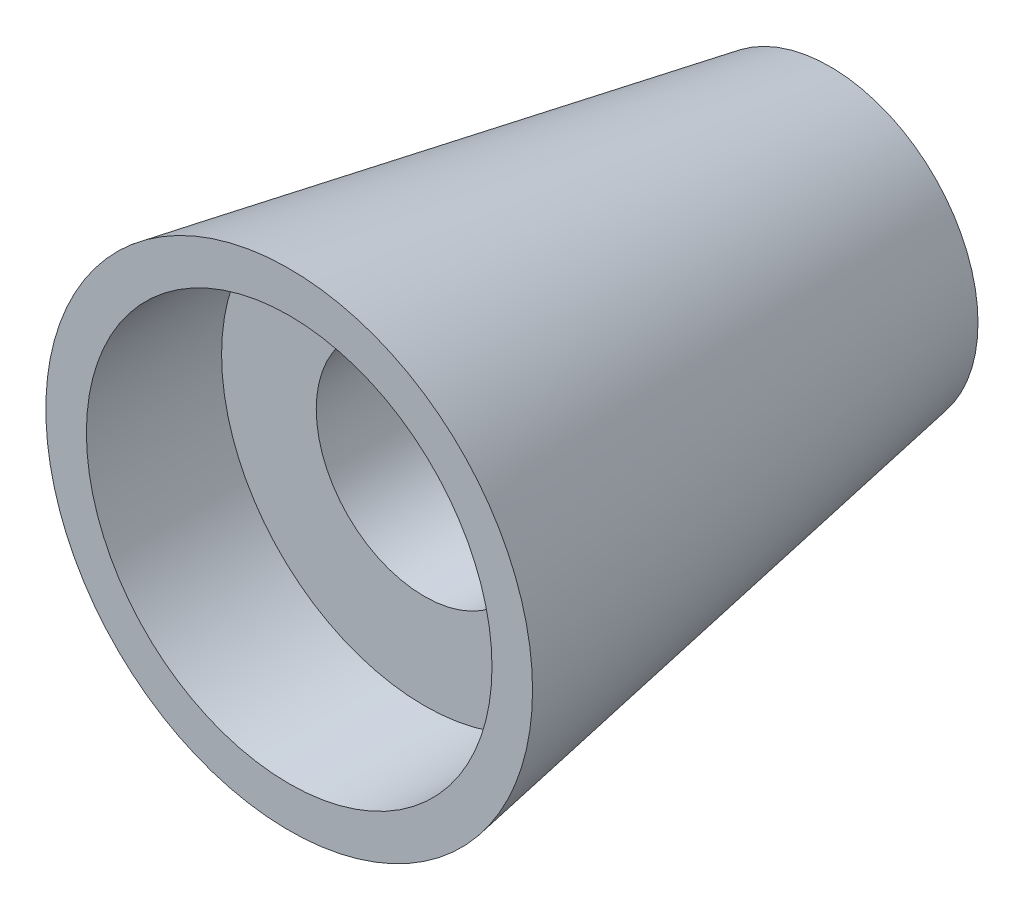
ISO-10303-21;
HEADER;
FILE_DESCRIPTION(('STEP AP214'),'2;1');
FILE_NAME('part.step','',(''),(''),'','','');
FILE_SCHEMA(('AUTOMOTIVE_DESIGN { 1 0 10303 214 1 1 1 1 }'));
ENDSEC;
DATA;
#1=APPLICATION_CONTEXT('core data for automotive mechanical design processes');
#2=APPLICATION_PROTOCOL_DEFINITION('international standard','automotive_design',2000,#1);
#3=PRODUCT_CONTEXT('',#1,'mechanical');
#4=PRODUCT('Part','Part','',(#3));
#5=PRODUCT_RELATED_PRODUCT_CATEGORY('part','',(#4));
#6=PRODUCT_DEFINITION_FORMATION('','',#4);
#7=PRODUCT_DEFINITION_CONTEXT('part definition',#1,'design');
#8=PRODUCT_DEFINITION('design','',#6,#7);
#9=PRODUCT_DEFINITION_SHAPE('','',#8);
#10=(LENGTH_UNIT() NAMED_UNIT(*) SI_UNIT(.MILLI.,.METRE.));
#11=(NAMED_UNIT(*) PLANE_ANGLE_UNIT() SI_UNIT($,.RADIAN.));
#12=(NAMED_UNIT(*) SI_UNIT($,.STERADIAN.) SOLID_ANGLE_UNIT());
#13=UNCERTAINTY_MEASURE_WITH_UNIT(LENGTH_MEASURE(1.E-05),#10,'distance_accuracy_value','');
#14=(GEOMETRIC_REPRESENTATION_CONTEXT(3) GLOBAL_UNCERTAINTY_ASSIGNED_CONTEXT((#13)) GLOBAL_UNIT_ASSIGNED_CONTEXT((#10,
#11,#12)) REPRESENTATION_CONTEXT('',''));
#15=CARTESIAN_POINT('',(0.,0.,0.));
#16=DIRECTION('',(0.,0.,1.));
#17=DIRECTION('',(1.,0.,0.));
#18=AXIS2_PLACEMENT_3D('',#15,#16,#17);
#19=CARTESIAN_POINT('',(0.,0.,20.));
#20=DIRECTION('',(0.,0.,1.));
#21=DIRECTION('',(1.,0.,0.));
#22=AXIS2_PLACEMENT_3D('',#19,#20,#21);
#23=CONICAL_SURFACE('',#22,9.,0.174532925199433);
#24=CARTESIAN_POINT('',(0.,0.,20.));
#25=DIRECTION('',(0.,0.,1.));
#26=DIRECTION('',(1.,0.,0.));
#27=AXIS2_PLACEMENT_3D('',#24,#25,#26);
#28=CIRCLE('',#27,9.);
#29=CARTESIAN_POINT('',(9.,0.,20.));
#30=VERTEX_POINT('',#29);
#31=EDGE_CURVE('E10',#30,#30,#28,.T.);
#32=ORIENTED_EDGE('',*,*,#31,.F.);
#33=EDGE_LOOP('',(#32));
#34=FACE_BOUND('',#33,.T.);
#35=CARTESIAN_POINT('',(0.,0.,0.));
#36=DIRECTION('',(0.,0.,1.));
#37=DIRECTION('',(1.,0.,0.));
#38=AXIS2_PLACEMENT_3D('',#35,#36,#37);
#39=CIRCLE('',#38,5.47346038583069);
#40=CARTESIAN_POINT('',(5.47346038583069,0.,0.));
#41=VERTEX_POINT('',#40);
#42=EDGE_CURVE('E34',#41,#41,#39,.T.);
#43=ORIENTED_EDGE('',*,*,#42,.T.);
#44=EDGE_LOOP('',(#43));
#45=FACE_BOUND('',#44,.T.);
#46=ADVANCED_FACE('F27',(#34,#45),#23,.T.);
#47=CARTESIAN_POINT('',(0.,0.,20.));
#48=DIRECTION('',(0.,0.,1.));
#49=DIRECTION('',(1.,0.,0.));
#50=AXIS2_PLACEMENT_3D('',#47,#48,#49);
#51=PLANE('',#50);
#52=CARTESIAN_POINT('',(0.,0.,20.));
#53=DIRECTION('',(0.,0.,1.));
#54=DIRECTION('',(1.,0.,0.));
#55=AXIS2_PLACEMENT_3D('',#52,#53,#54);
#56=CIRCLE('',#55,7.5);
#57=CARTESIAN_POINT('',(7.5,0.,20.));
#58=VERTEX_POINT('',#57);
#59=EDGE_CURVE('E46',#58,#58,#56,.T.);
#60=ORIENTED_EDGE('',*,*,#59,.F.);
#61=EDGE_LOOP('',(#60));
#62=FACE_BOUND('',#61,.T.);
#63=ORIENTED_EDGE('',*,*,#31,.T.);
#64=EDGE_LOOP('',(#63));
#65=FACE_BOUND('',#64,.T.);
#66=ADVANCED_FACE('F62',(#62,#65),#51,.T.);
#67=CARTESIAN_POINT('',(0.,0.,0.));
#68=DIRECTION('',(0.,0.,1.));
#69=DIRECTION('',(1.,0.,0.));
#70=AXIS2_PLACEMENT_3D('',#67,#68,#69);
#71=PLANE('',#70);
#72=CARTESIAN_POINT('',(0.,0.,0.));
#73=DIRECTION('',(0.,0.,-1.));
#74=DIRECTION('',(-1.,0.,0.));
#75=AXIS2_PLACEMENT_3D('',#72,#73,#74);
#76=CIRCLE('',#75,4.25);
#77=CARTESIAN_POINT('',(-4.25,0.,0.));
#78=VERTEX_POINT('',#77);
#79=EDGE_CURVE('E52',#78,#78,#76,.T.);
#80=ORIENTED_EDGE('',*,*,#79,.F.);
#81=EDGE_LOOP('',(#80));
#82=FACE_BOUND('',#81,.T.);
#83=ORIENTED_EDGE('',*,*,#42,.F.);
#84=EDGE_LOOP('',(#83));
#85=FACE_BOUND('',#84,.T.);
#86=ADVANCED_FACE('F58',(#82,#85),#71,.F.);
#87=CARTESIAN_POINT('',(0.,0.,15.));
#88=DIRECTION('',(0.,0.,1.));
#89=DIRECTION('',(1.,0.,0.));
#90=AXIS2_PLACEMENT_3D('',#87,#88,#89);
#91=PLANE('',#90);
#92=CARTESIAN_POINT('',(0.,0.,15.));
#93=DIRECTION('',(0.,0.,1.));
#94=DIRECTION('',(1.,0.,0.));
#95=AXIS2_PLACEMENT_3D('',#92,#93,#94);
#96=CIRCLE('',#95,7.5);
#97=CARTESIAN_POINT('',(7.5,0.,15.));
#98=VERTEX_POINT('',#97);
#99=EDGE_CURVE('E43',#98,#98,#96,.T.);
#100=ORIENTED_EDGE('',*,*,#99,.T.);
#101=EDGE_LOOP('',(#100));
#102=FACE_BOUND('',#101,.T.);
#103=CARTESIAN_POINT('',(0.,0.,15.));
#104=DIRECTION('',(0.,0.,1.));
#105=DIRECTION('',(1.,0.,0.));
#106=AXIS2_PLACEMENT_3D('',#103,#104,#105);
#107=CIRCLE('',#106,4.);
#108=CARTESIAN_POINT('',(4.,0.,15.));
#109=VERTEX_POINT('',#108);
#110=EDGE_CURVE('E30',#109,#109,#107,.F.);
#111=ORIENTED_EDGE('',*,*,#110,.T.);
#112=EDGE_LOOP('',(#111));
#113=FACE_BOUND('',#112,.T.);
#114=ADVANCED_FACE('F61',(#102,#113),#91,.T.);
#115=CARTESIAN_POINT('',(0.,0.,15.));
#116=DIRECTION('',(0.,0.,1.));
#117=DIRECTION('',(1.,0.,0.));
#118=AXIS2_PLACEMENT_3D('',#115,#116,#117);
#119=CYLINDRICAL_SURFACE('',#118,7.5);
#120=ORIENTED_EDGE('',*,*,#99,.F.);
#121=EDGE_LOOP('',(#120));
#122=FACE_BOUND('',#121,.T.);
#123=ORIENTED_EDGE('',*,*,#59,.T.);
#124=EDGE_LOOP('',(#123));
#125=FACE_BOUND('',#124,.T.);
#126=ADVANCED_FACE('F83',(#122,#125),#119,.F.);
#127=CARTESIAN_POINT('',(0.,0.,10.));
#128=DIRECTION('',(0.,0.,1.));
#129=DIRECTION('',(1.,0.,0.));
#130=AXIS2_PLACEMENT_3D('',#127,#128,#129);
#131=PLANE('',#130);
#132=CARTESIAN_POINT('',(0.,0.,10.));
#133=DIRECTION('',(0.,0.,1.));
#134=DIRECTION('',(1.,0.,0.));
#135=AXIS2_PLACEMENT_3D('',#132,#133,#134);
#136=CIRCLE('',#135,4.);
#137=CARTESIAN_POINT('',(4.,0.,10.));
#138=VERTEX_POINT('',#137);
#139=EDGE_CURVE('E39',#138,#138,#136,.T.);
#140=ORIENTED_EDGE('',*,*,#139,.T.);
#141=EDGE_LOOP('',(#140));
#142=FACE_BOUND('',#141,.T.);
#143=ADVANCED_FACE('F79',(#142),#131,.T.);
#144=CARTESIAN_POINT('',(0.,0.,10.));
#145=DIRECTION('',(0.,0.,1.));
#146=DIRECTION('',(1.,0.,0.));
#147=AXIS2_PLACEMENT_3D('',#144,#145,#146);
#148=CYLINDRICAL_SURFACE('',#147,4.);
#149=ORIENTED_EDGE('',*,*,#139,.F.);
#150=EDGE_LOOP('',(#149));
#151=FACE_BOUND('',#150,.T.);
#152=ORIENTED_EDGE('',*,*,#110,.F.);
#153=EDGE_LOOP('',(#152));
#154=FACE_BOUND('',#153,.T.);
#155=ADVANCED_FACE('F76',(#151,#154),#148,.F.);
#156=CARTESIAN_POINT('',(0.,0.,0.5));
#157=DIRECTION('',(0.,0.,-1.));
#158=DIRECTION('',(-1.,0.,0.));
#159=AXIS2_PLACEMENT_3D('',#156,#157,#158);
#160=CYLINDRICAL_SURFACE('',#159,4.25);
#161=CARTESIAN_POINT('',(0.,0.,0.5));
#162=DIRECTION('',(0.,0.,-1.));
#163=DIRECTION('',(-1.,0.,0.));
#164=AXIS2_PLACEMENT_3D('',#161,#162,#163);
#165=CIRCLE('',#164,4.25);
#166=CARTESIAN_POINT('',(-4.25,0.,0.5));
#167=VERTEX_POINT('',#166);
#168=EDGE_CURVE('E49',#167,#167,#165,.T.);
#169=ORIENTED_EDGE('',*,*,#168,.F.);
#170=EDGE_LOOP('',(#169));
#171=FACE_BOUND('',#170,.T.);
#172=ORIENTED_EDGE('',*,*,#79,.T.);
#173=EDGE_LOOP('',(#172));
#174=FACE_BOUND('',#173,.T.);
#175=ADVANCED_FACE('F56',(#171,#174),#160,.F.);
#176=CARTESIAN_POINT('',(0.,0.,0.5));
#177=DIRECTION('',(0.,0.,-1.));
#178=DIRECTION('',(-1.,0.,0.));
#179=AXIS2_PLACEMENT_3D('',#176,#177,#178);
#180=PLANE('',#179);
#181=ORIENTED_EDGE('',*,*,#168,.T.);
#182=EDGE_LOOP('',(#181));
#183=FACE_BOUND('',#182,.T.);
#184=ADVANCED_FACE('F93',(#183),#180,.T.);
#185=CLOSED_SHELL('',(#46,#66,#86,#114,#126,#143,#155,#175,#184));
#186=MANIFOLD_SOLID_BREP('B2',#185);
#187=ADVANCED_BREP_SHAPE_REPRESENTATION('',(#18,#186),#14);
#188=SHAPE_DEFINITION_REPRESENTATION(#9,#187);
ENDSEC;
END-ISO-10303-21;
